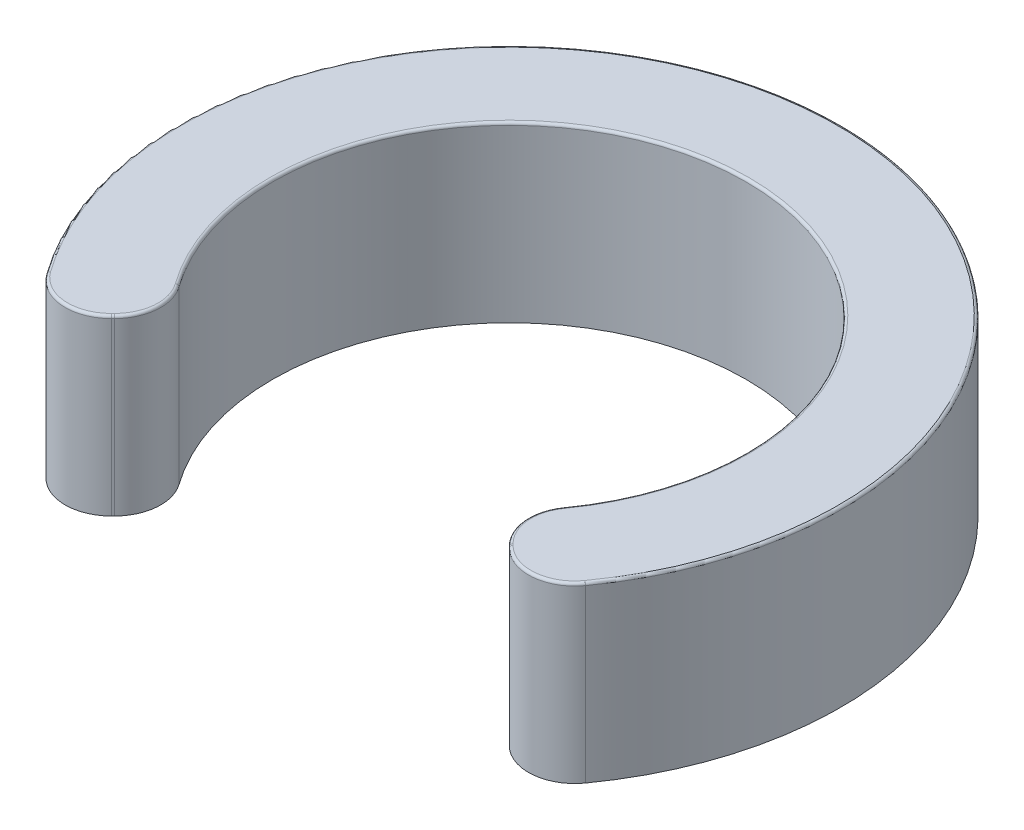
ISO-10303-21;
HEADER;
FILE_DESCRIPTION(('STEP AP214'),'2;1');
FILE_NAME('part.step','',(''),(''),'','','');
FILE_SCHEMA(('AUTOMOTIVE_DESIGN { 1 0 10303 214 1 1 1 1 }'));
ENDSEC;
DATA;
#1=APPLICATION_CONTEXT('core data for automotive mechanical design processes');
#2=APPLICATION_PROTOCOL_DEFINITION('international standard','automotive_design',2000,#1);
#3=PRODUCT_CONTEXT('',#1,'mechanical');
#4=PRODUCT('Part','Part','',(#3));
#5=PRODUCT_RELATED_PRODUCT_CATEGORY('part','',(#4));
#6=PRODUCT_DEFINITION_FORMATION('','',#4);
#7=PRODUCT_DEFINITION_CONTEXT('part definition',#1,'design');
#8=PRODUCT_DEFINITION('design','',#6,#7);
#9=PRODUCT_DEFINITION_SHAPE('','',#8);
#10=(LENGTH_UNIT() NAMED_UNIT(*) SI_UNIT(.MILLI.,.METRE.));
#11=(NAMED_UNIT(*) PLANE_ANGLE_UNIT() SI_UNIT($,.RADIAN.));
#12=(NAMED_UNIT(*) SI_UNIT($,.STERADIAN.) SOLID_ANGLE_UNIT());
#13=UNCERTAINTY_MEASURE_WITH_UNIT(LENGTH_MEASURE(1.E-05),#10,'distance_accuracy_value','');
#14=(GEOMETRIC_REPRESENTATION_CONTEXT(3) GLOBAL_UNCERTAINTY_ASSIGNED_CONTEXT((#13)) GLOBAL_UNIT_ASSIGNED_CONTEXT((#10,
#11,#12)) REPRESENTATION_CONTEXT('',''));
#15=CARTESIAN_POINT('',(0.,0.,0.));
#16=DIRECTION('',(0.,0.,1.));
#17=DIRECTION('',(1.,0.,0.));
#18=AXIS2_PLACEMENT_3D('',#15,#16,#17);
#19=CARTESIAN_POINT('',(0.,1.625,0.));
#20=DIRECTION('',(0.,-1.,0.));
#21=DIRECTION('',(0.,0.,-1.));
#22=AXIS2_PLACEMENT_3D('',#19,#20,#21);
#23=TOROIDAL_SURFACE('',#22,2.275,0.025);
#24=CARTESIAN_POINT('',(0.,1.625,0.));
#25=DIRECTION('',(0.,1.,0.));
#26=DIRECTION('',(0.,0.,-1.));
#27=AXIS2_PLACEMENT_3D('',#24,#25,#26);
#28=CIRCLE('',#27,2.25);
#29=CARTESIAN_POINT('',(1.82979902024299,1.625,1.30932637089375));
#30=VERTEX_POINT('',#29);
#31=CARTESIAN_POINT('',(-1.82979902024296,1.625,1.30932637089378));
#32=VERTEX_POINT('',#31);
#33=EDGE_CURVE('E163',#30,#32,#28,.T.);
#34=ORIENTED_EDGE('',*,*,#33,.F.);
#35=CARTESIAN_POINT('',(1.85013012046791,1.625,1.32387444168146));
#36=DIRECTION('',(0.581922831508337,0.,-0.813244008996881));
#37=DIRECTION('',(-0.813244008996881,0.,-0.581922831508337));
#38=AXIS2_PLACEMENT_3D('',#35,#36,#37);
#39=CIRCLE('',#38,0.025);
#40=CARTESIAN_POINT('',(1.85013012046791,1.65,1.32387444168146));
#41=VERTEX_POINT('',#40);
#42=EDGE_CURVE('E137',#30,#41,#39,.T.);
#43=ORIENTED_EDGE('',*,*,#42,.T.);
#44=CARTESIAN_POINT('',(0.,1.65,0.));
#45=DIRECTION('',(0.,-1.,0.));
#46=DIRECTION('',(0.,0.,-1.));
#47=AXIS2_PLACEMENT_3D('',#44,#45,#46);
#48=CIRCLE('',#47,2.275);
#49=CARTESIAN_POINT('',(-1.85013012046789,1.65,1.32387444168149));
#50=VERTEX_POINT('',#49);
#51=EDGE_CURVE('E148',#50,#41,#48,.T.);
#52=ORIENTED_EDGE('',*,*,#51,.F.);
#53=CARTESIAN_POINT('',(-1.85013012046789,1.625,1.32387444168149));
#54=DIRECTION('',(0.581922831508347,0.,0.813244008996874));
#55=DIRECTION('',(0.813244008996874,0.,-0.581922831508347));
#56=AXIS2_PLACEMENT_3D('',#53,#54,#55);
#57=CIRCLE('',#56,0.025);
#58=EDGE_CURVE('E36',#32,#50,#57,.T.);
#59=ORIENTED_EDGE('',*,*,#58,.F.);
#60=EDGE_LOOP('',(#34,#43,#52,#59));
#61=FACE_BOUND('',#60,.T.);
#62=ADVANCED_FACE('F17',(#61),#23,.T.);
#63=CARTESIAN_POINT('',(0.,1.625,0.));
#64=DIRECTION('',(0.,-1.,0.));
#65=DIRECTION('',(0.,0.,-1.));
#66=AXIS2_PLACEMENT_3D('',#63,#64,#65);
#67=TOROIDAL_SURFACE('',#66,3.125,0.025);
#68=CARTESIAN_POINT('',(0.,1.65,0.));
#69=DIRECTION('',(0.,1.,0.));
#70=DIRECTION('',(0.,0.,-1.));
#71=AXIS2_PLACEMENT_3D('',#68,#69,#70);
#72=CIRCLE('',#71,3.125);
#73=CARTESIAN_POINT('',(2.53916067045771,1.65,1.82161688881081));
#74=VERTEX_POINT('',#73);
#75=CARTESIAN_POINT('',(-2.53916067045768,1.65,1.82161688881085));
#76=VERTEX_POINT('',#75);
#77=EDGE_CURVE('E109',#74,#76,#72,.T.);
#78=ORIENTED_EDGE('',*,*,#77,.F.);
#79=CARTESIAN_POINT('',(2.53916067045771,1.625,1.82161688881081));
#80=DIRECTION('',(0.582917404419459,0.,-0.812531414546466));
#81=DIRECTION('',(-0.812531414546466,0.,-0.582917404419459));
#82=AXIS2_PLACEMENT_3D('',#79,#80,#81);
#83=CIRCLE('',#82,0.025);
#84=CARTESIAN_POINT('',(2.55947395582137,1.625,1.83618982392129));
#85=VERTEX_POINT('',#84);
#86=EDGE_CURVE('E112',#74,#85,#83,.T.);
#87=ORIENTED_EDGE('',*,*,#86,.T.);
#88=CARTESIAN_POINT('',(0.,1.625,0.));
#89=DIRECTION('',(0.,-1.,0.));
#90=DIRECTION('',(0.,0.,-1.));
#91=AXIS2_PLACEMENT_3D('',#88,#89,#90);
#92=CIRCLE('',#91,3.15);
#93=CARTESIAN_POINT('',(-2.55947395582134,1.625,1.83618982392134));
#94=VERTEX_POINT('',#93);
#95=EDGE_CURVE('E11',#94,#85,#92,.T.);
#96=ORIENTED_EDGE('',*,*,#95,.F.);
#97=CARTESIAN_POINT('',(-2.53916067045768,1.625,1.82161688881085));
#98=DIRECTION('',(0.582917404419479,0.,0.812531414546452));
#99=DIRECTION('',(0.812531414546452,0.,-0.582917404419479));
#100=AXIS2_PLACEMENT_3D('',#97,#98,#99);
#101=CIRCLE('',#100,0.0249999999999999);
#102=EDGE_CURVE('E113',#76,#94,#101,.T.);
#103=ORIENTED_EDGE('',*,*,#102,.F.);
#104=EDGE_LOOP('',(#78,#87,#96,#103));
#105=FACE_BOUND('',#104,.T.);
#106=ADVANCED_FACE('F110',(#105),#67,.T.);
#107=CARTESIAN_POINT('',(0.,1.65,0.));
#108=DIRECTION('',(0.,-1.,0.));
#109=DIRECTION('',(0.,0.,-1.));
#110=AXIS2_PLACEMENT_3D('',#107,#108,#109);
#111=CYLINDRICAL_SURFACE('',#110,3.15);
#112=ORIENTED_EDGE('',*,*,#95,.T.);
#113=DIRECTION('',(0.,-1.,0.));
#114=VECTOR('',#113,1.);
#115=CARTESIAN_POINT('',(2.55947395582137,1.65,1.83618982392129));
#116=LINE('',#115,#114);
#117=CARTESIAN_POINT('',(2.55947395582137,0.,1.83618982392129));
#118=VERTEX_POINT('',#117);
#119=EDGE_CURVE('E181',#85,#118,#116,.T.);
#120=ORIENTED_EDGE('',*,*,#119,.T.);
#121=CARTESIAN_POINT('',(0.,0.,0.));
#122=DIRECTION('',(0.,-1.,0.));
#123=DIRECTION('',(0.,0.,-1.));
#124=AXIS2_PLACEMENT_3D('',#121,#122,#123);
#125=CIRCLE('',#124,3.15);
#126=CARTESIAN_POINT('',(-2.55947395582134,0.,1.83618982392134));
#127=VERTEX_POINT('',#126);
#128=EDGE_CURVE('E152',#127,#118,#125,.T.);
#129=ORIENTED_EDGE('',*,*,#128,.F.);
#130=DIRECTION('',(0.,-1.,0.));
#131=VECTOR('',#130,1.);
#132=CARTESIAN_POINT('',(-2.55947395582134,1.65,1.83618982392134));
#133=LINE('',#132,#131);
#134=EDGE_CURVE('E156',#94,#127,#133,.T.);
#135=ORIENTED_EDGE('',*,*,#134,.F.);
#136=EDGE_LOOP('',(#112,#120,#129,#135));
#137=FACE_BOUND('',#136,.T.);
#138=ADVANCED_FACE('F243',(#137),#111,.T.);
#139=CARTESIAN_POINT('',(0.,1.65,0.));
#140=DIRECTION('',(0.,-1.,0.));
#141=DIRECTION('',(0.,0.,-1.));
#142=AXIS2_PLACEMENT_3D('',#139,#140,#141);
#143=CYLINDRICAL_SURFACE('',#142,2.25);
#144=DIRECTION('',(0.,-1.,0.));
#145=VECTOR('',#144,1.);
#146=CARTESIAN_POINT('',(1.82979902024299,1.65,1.30932637089375));
#147=LINE('',#146,#145);
#148=CARTESIAN_POINT('',(1.82979902024299,0.,1.30932637089375));
#149=VERTEX_POINT('',#148);
#150=EDGE_CURVE('E164',#30,#149,#147,.T.);
#151=ORIENTED_EDGE('',*,*,#150,.F.);
#152=ORIENTED_EDGE('',*,*,#33,.T.);
#153=DIRECTION('',(0.,-1.,0.));
#154=VECTOR('',#153,1.);
#155=CARTESIAN_POINT('',(-1.82979902024296,1.65,1.30932637089378));
#156=LINE('',#155,#154);
#157=CARTESIAN_POINT('',(-1.82979902024296,0.,1.30932637089378));
#158=VERTEX_POINT('',#157);
#159=EDGE_CURVE('E168',#32,#158,#156,.T.);
#160=ORIENTED_EDGE('',*,*,#159,.T.);
#161=CARTESIAN_POINT('',(0.,0.,0.));
#162=DIRECTION('',(0.,-1.,0.));
#163=DIRECTION('',(0.,0.,-1.));
#164=AXIS2_PLACEMENT_3D('',#161,#162,#163);
#165=CIRCLE('',#164,2.25);
#166=EDGE_CURVE('E27',#158,#149,#165,.T.);
#167=ORIENTED_EDGE('',*,*,#166,.T.);
#168=EDGE_LOOP('',(#151,#152,#160,#167));
#169=FACE_BOUND('',#168,.T.);
#170=ADVANCED_FACE('F229',(#169),#143,.F.);
#171=CARTESIAN_POINT('',(2.18762638420161,1.65,1.56537241675742));
#172=DIRECTION('',(0.,-1.,0.));
#173=DIRECTION('',(0.,0.,-1.));
#174=AXIS2_PLACEMENT_3D('',#171,#172,#173);
#175=CYLINDRICAL_SURFACE('',#174,0.44);
#176=DIRECTION('',(0.,-1.,0.));
#177=VECTOR('',#176,1.);
#178=CARTESIAN_POINT('',(1.87649940047954,1.65,1.8764994004795));
#179=LINE('',#178,#177);
#180=CARTESIAN_POINT('',(1.87649940047954,1.625,1.8764994004795));
#181=VERTEX_POINT('',#180);
#182=CARTESIAN_POINT('',(1.87649940047954,0.,1.8764994004795));
#183=VERTEX_POINT('',#182);
#184=EDGE_CURVE('E171',#181,#183,#179,.T.);
#185=ORIENTED_EDGE('',*,*,#184,.F.);
#186=CARTESIAN_POINT('',(2.18762638420161,1.625,1.56537241675742));
#187=DIRECTION('',(0.,-1.,0.));
#188=DIRECTION('',(0.,0.,-1.));
#189=AXIS2_PLACEMENT_3D('',#186,#187,#188);
#190=CIRCLE('',#189,0.44);
#191=EDGE_CURVE('E166',#181,#30,#190,.T.);
#192=ORIENTED_EDGE('',*,*,#191,.T.);
#193=ORIENTED_EDGE('',*,*,#150,.T.);
#194=CARTESIAN_POINT('',(2.18762638420161,0.,1.56537241675742));
#195=DIRECTION('',(0.,-1.,0.));
#196=DIRECTION('',(0.,0.,-1.));
#197=AXIS2_PLACEMENT_3D('',#194,#195,#196);
#198=CIRCLE('',#197,0.44);
#199=EDGE_CURVE('E131',#183,#149,#198,.T.);
#200=ORIENTED_EDGE('',*,*,#199,.F.);
#201=EDGE_LOOP('',(#185,#192,#193,#200));
#202=FACE_BOUND('',#201,.T.);
#203=ADVANCED_FACE('F231',(#202),#175,.T.);
#204=CARTESIAN_POINT('',(1.87649940047954,1.65,1.8764994004795));
#205=DIRECTION('',(0.707106781186558,0.,-0.707106781186537));
#206=DIRECTION('',(-0.707106781186537,0.,-0.707106781186558));
#207=AXIS2_PLACEMENT_3D('',#204,#205,#206);
#208=PLANE('',#207);
#209=DIRECTION('',(0.,-1.,0.));
#210=VECTOR('',#209,1.);
#211=CARTESIAN_POINT('',(1.89083314969885,1.65,1.89083314969881));
#212=LINE('',#211,#210);
#213=CARTESIAN_POINT('',(1.89083314969885,1.625,1.89083314969881));
#214=VERTEX_POINT('',#213);
#215=CARTESIAN_POINT('',(1.89083314969885,0.,1.89083314969881));
#216=VERTEX_POINT('',#215);
#217=EDGE_CURVE('E179',#214,#216,#212,.T.);
#218=ORIENTED_EDGE('',*,*,#217,.F.);
#219=DIRECTION('',(-0.707106781186537,0.,-0.707106781186558));
#220=VECTOR('',#219,1.);
#221=CARTESIAN_POINT('',(1.87649940047954,1.625,1.8764994004795));
#222=LINE('',#221,#220);
#223=EDGE_CURVE('E167',#214,#181,#222,.T.);
#224=ORIENTED_EDGE('',*,*,#223,.T.);
#225=ORIENTED_EDGE('',*,*,#184,.T.);
#226=DIRECTION('',(0.707106781186537,0.,0.707106781186558));
#227=VECTOR('',#226,1.);
#228=CARTESIAN_POINT('',(1.87649940047954,0.,1.8764994004795));
#229=LINE('',#228,#227);
#230=EDGE_CURVE('E174',#183,#216,#229,.T.);
#231=ORIENTED_EDGE('',*,*,#230,.T.);
#232=EDGE_LOOP('',(#218,#224,#225,#231));
#233=FACE_BOUND('',#232,.T.);
#234=ADVANCED_FACE('F236',(#233),#208,.F.);
#235=CARTESIAN_POINT('',(2.20196013342093,1.65,1.57970616597673));
#236=DIRECTION('',(0.,-1.,0.));
#237=DIRECTION('',(0.,0.,-1.));
#238=AXIS2_PLACEMENT_3D('',#235,#236,#237);
#239=CYLINDRICAL_SURFACE('',#238,0.440000000000001);
#240=ORIENTED_EDGE('',*,*,#119,.F.);
#241=CARTESIAN_POINT('',(2.20196013342093,1.625,1.57970616597673));
#242=DIRECTION('',(0.,-1.,0.));
#243=DIRECTION('',(0.,0.,-1.));
#244=AXIS2_PLACEMENT_3D('',#241,#242,#243);
#245=CIRCLE('',#244,0.440000000000001);
#246=EDGE_CURVE('E127',#85,#214,#245,.T.);
#247=ORIENTED_EDGE('',*,*,#246,.T.);
#248=ORIENTED_EDGE('',*,*,#217,.T.);
#249=CARTESIAN_POINT('',(2.20196013342093,0.,1.57970616597673));
#250=DIRECTION('',(0.,-1.,0.));
#251=DIRECTION('',(0.,0.,-1.));
#252=AXIS2_PLACEMENT_3D('',#249,#250,#251);
#253=CIRCLE('',#252,0.440000000000001);
#254=EDGE_CURVE('E155',#118,#216,#253,.T.);
#255=ORIENTED_EDGE('',*,*,#254,.F.);
#256=EDGE_LOOP('',(#240,#247,#248,#255));
#257=FACE_BOUND('',#256,.T.);
#258=ADVANCED_FACE('F241',(#257),#239,.T.);
#259=CARTESIAN_POINT('',(-2.2019601334209,1.65,1.57970616597677));
#260=DIRECTION('',(0.,-1.,0.));
#261=DIRECTION('',(0.,0.,-1.));
#262=AXIS2_PLACEMENT_3D('',#259,#260,#261);
#263=CYLINDRICAL_SURFACE('',#262,0.44);
#264=DIRECTION('',(0.,-1.,0.));
#265=VECTOR('',#264,1.);
#266=CARTESIAN_POINT('',(-1.89083314969881,1.65,1.89083314969885));
#267=LINE('',#266,#265);
#268=CARTESIAN_POINT('',(-1.89083314969881,1.625,1.89083314969885));
#269=VERTEX_POINT('',#268);
#270=CARTESIAN_POINT('',(-1.89083314969881,0.,1.89083314969885));
#271=VERTEX_POINT('',#270);
#272=EDGE_CURVE('E191',#269,#271,#267,.T.);
#273=ORIENTED_EDGE('',*,*,#272,.F.);
#274=CARTESIAN_POINT('',(-2.2019601334209,1.625,1.57970616597677));
#275=DIRECTION('',(0.,-1.,0.));
#276=DIRECTION('',(0.,0.,-1.));
#277=AXIS2_PLACEMENT_3D('',#274,#275,#276);
#278=CIRCLE('',#277,0.44);
#279=EDGE_CURVE('E159',#269,#94,#278,.T.);
#280=ORIENTED_EDGE('',*,*,#279,.T.);
#281=ORIENTED_EDGE('',*,*,#134,.T.);
#282=CARTESIAN_POINT('',(-2.2019601334209,0.,1.57970616597677));
#283=DIRECTION('',(0.,-1.,0.));
#284=DIRECTION('',(0.,0.,-1.));
#285=AXIS2_PLACEMENT_3D('',#282,#283,#284);
#286=CIRCLE('',#285,0.44);
#287=EDGE_CURVE('E154',#271,#127,#286,.T.);
#288=ORIENTED_EDGE('',*,*,#287,.F.);
#289=EDGE_LOOP('',(#273,#280,#281,#288));
#290=FACE_BOUND('',#289,.T.);
#291=ADVANCED_FACE('F247',(#290),#263,.T.);
#292=CARTESIAN_POINT('',(-1.89083314969881,1.65,1.89083314969885));
#293=DIRECTION('',(-0.707106781186553,0.,-0.707106781186542));
#294=DIRECTION('',(-0.707106781186542,0.,0.707106781186553));
#295=AXIS2_PLACEMENT_3D('',#292,#293,#294);
#296=PLANE('',#295);
#297=DIRECTION('',(0.,-1.,0.));
#298=VECTOR('',#297,1.);
#299=CARTESIAN_POINT('',(-1.8764994004795,1.65,1.87649940047954));
#300=LINE('',#299,#298);
#301=CARTESIAN_POINT('',(-1.8764994004795,1.625,1.87649940047954));
#302=VERTEX_POINT('',#301);
#303=CARTESIAN_POINT('',(-1.8764994004795,0.,1.87649940047954));
#304=VERTEX_POINT('',#303);
#305=EDGE_CURVE('E200',#302,#304,#300,.T.);
#306=ORIENTED_EDGE('',*,*,#305,.F.);
#307=DIRECTION('',(-0.707106781186542,0.,0.707106781186553));
#308=VECTOR('',#307,1.);
#309=CARTESIAN_POINT('',(-1.89083314969881,1.625,1.89083314969885));
#310=LINE('',#309,#308);
#311=EDGE_CURVE('E160',#302,#269,#310,.T.);
#312=ORIENTED_EDGE('',*,*,#311,.T.);
#313=ORIENTED_EDGE('',*,*,#272,.T.);
#314=DIRECTION('',(0.707106781186542,0.,-0.707106781186553));
#315=VECTOR('',#314,1.);
#316=CARTESIAN_POINT('',(-1.89083314969881,0.,1.89083314969885));
#317=LINE('',#316,#315);
#318=EDGE_CURVE('E194',#271,#304,#317,.T.);
#319=ORIENTED_EDGE('',*,*,#318,.T.);
#320=EDGE_LOOP('',(#306,#312,#313,#319));
#321=FACE_BOUND('',#320,.T.);
#322=ADVANCED_FACE('F259',(#321),#296,.F.);
#323=CARTESIAN_POINT('',(-2.18762638420159,1.65,1.56537241675746));
#324=DIRECTION('',(0.,-1.,0.));
#325=DIRECTION('',(0.,0.,-1.));
#326=AXIS2_PLACEMENT_3D('',#323,#324,#325);
#327=CYLINDRICAL_SURFACE('',#326,0.44);
#328=ORIENTED_EDGE('',*,*,#159,.F.);
#329=CARTESIAN_POINT('',(-2.18762638420159,1.625,1.56537241675746));
#330=DIRECTION('',(0.,-1.,0.));
#331=DIRECTION('',(0.,0.,-1.));
#332=AXIS2_PLACEMENT_3D('',#329,#330,#331);
#333=CIRCLE('',#332,0.44);
#334=EDGE_CURVE('E202',#32,#302,#333,.T.);
#335=ORIENTED_EDGE('',*,*,#334,.T.);
#336=ORIENTED_EDGE('',*,*,#305,.T.);
#337=CARTESIAN_POINT('',(-2.18762638420159,0.,1.56537241675746));
#338=DIRECTION('',(0.,-1.,0.));
#339=DIRECTION('',(0.,0.,-1.));
#340=AXIS2_PLACEMENT_3D('',#337,#338,#339);
#341=CIRCLE('',#340,0.44);
#342=EDGE_CURVE('E199',#158,#304,#341,.T.);
#343=ORIENTED_EDGE('',*,*,#342,.F.);
#344=EDGE_LOOP('',(#328,#335,#336,#343));
#345=FACE_BOUND('',#344,.T.);
#346=ADVANCED_FACE('F253',(#345),#327,.T.);
#347=CARTESIAN_POINT('',(0.,1.65,0.));
#348=DIRECTION('',(0.,-1.,0.));
#349=DIRECTION('',(0.,0.,-1.));
#350=AXIS2_PLACEMENT_3D('',#347,#348,#349);
#351=PLANE('',#350);
#352=DIRECTION('',(0.707106781186542,0.,-0.707106781186553));
#353=VECTOR('',#352,1.);
#354=CARTESIAN_POINT('',(-0.017677669529662,1.65,-0.0176776695296618));
#355=LINE('',#354,#353);
#356=CARTESIAN_POINT('',(-1.90851081922848,1.65,1.87315548016918));
#357=VERTEX_POINT('',#356);
#358=CARTESIAN_POINT('',(-1.89417707000917,1.65,1.85882173094987));
#359=VERTEX_POINT('',#358);
#360=EDGE_CURVE('E203',#357,#359,#355,.T.);
#361=ORIENTED_EDGE('',*,*,#360,.T.);
#362=CARTESIAN_POINT('',(-2.18762638420159,1.65,1.56537241675746));
#363=DIRECTION('',(0.,1.,0.));
#364=DIRECTION('',(0.,0.,-1.));
#365=AXIS2_PLACEMENT_3D('',#362,#363,#364);
#366=CIRCLE('',#365,0.415);
#367=EDGE_CURVE('E213',#359,#50,#366,.T.);
#368=ORIENTED_EDGE('',*,*,#367,.T.);
#369=ORIENTED_EDGE('',*,*,#51,.T.);
#370=CARTESIAN_POINT('',(2.18762638420161,1.65,1.56537241675742));
#371=DIRECTION('',(0.,1.,0.));
#372=DIRECTION('',(0.,0.,-1.));
#373=AXIS2_PLACEMENT_3D('',#370,#371,#372);
#374=CIRCLE('',#373,0.415);
#375=CARTESIAN_POINT('',(1.8941770700092,1.65,1.85882173094984));
#376=VERTEX_POINT('',#375);
#377=EDGE_CURVE('E216',#41,#376,#374,.T.);
#378=ORIENTED_EDGE('',*,*,#377,.T.);
#379=DIRECTION('',(0.707106781186537,0.,0.707106781186558));
#380=VECTOR('',#379,1.);
#381=CARTESIAN_POINT('',(0.0176776695297083,1.65,-0.0176776695297078));
#382=LINE('',#381,#380);
#383=CARTESIAN_POINT('',(1.90851081922851,1.65,1.87315548016915));
#384=VERTEX_POINT('',#383);
#385=EDGE_CURVE('E121',#376,#384,#382,.T.);
#386=ORIENTED_EDGE('',*,*,#385,.T.);
#387=CARTESIAN_POINT('',(2.20196013342093,1.65,1.57970616597673));
#388=DIRECTION('',(0.,1.,0.));
#389=DIRECTION('',(0.,0.,-1.));
#390=AXIS2_PLACEMENT_3D('',#387,#388,#389);
#391=CIRCLE('',#390,0.415000000000001);
#392=EDGE_CURVE('E103',#384,#74,#391,.T.);
#393=ORIENTED_EDGE('',*,*,#392,.T.);
#394=ORIENTED_EDGE('',*,*,#77,.T.);
#395=CARTESIAN_POINT('',(-2.2019601334209,1.65,1.57970616597677));
#396=DIRECTION('',(0.,1.,0.));
#397=DIRECTION('',(0.,0.,-1.));
#398=AXIS2_PLACEMENT_3D('',#395,#396,#397);
#399=CIRCLE('',#398,0.415);
#400=EDGE_CURVE('E116',#76,#357,#399,.T.);
#401=ORIENTED_EDGE('',*,*,#400,.T.);
#402=EDGE_LOOP('',(#361,#368,#369,#378,#386,#393,#394,#401));
#403=FACE_BOUND('',#402,.T.);
#404=ADVANCED_FACE('F119',(#403),#351,.F.);
#405=CARTESIAN_POINT('',(0.,0.,0.));
#406=DIRECTION('',(0.,-1.,0.));
#407=DIRECTION('',(0.,0.,-1.));
#408=AXIS2_PLACEMENT_3D('',#405,#406,#407);
#409=PLANE('',#408);
#410=ORIENTED_EDGE('',*,*,#166,.F.);
#411=ORIENTED_EDGE('',*,*,#342,.T.);
#412=ORIENTED_EDGE('',*,*,#318,.F.);
#413=ORIENTED_EDGE('',*,*,#287,.T.);
#414=ORIENTED_EDGE('',*,*,#128,.T.);
#415=ORIENTED_EDGE('',*,*,#254,.T.);
#416=ORIENTED_EDGE('',*,*,#230,.F.);
#417=ORIENTED_EDGE('',*,*,#199,.T.);
#418=EDGE_LOOP('',(#410,#411,#412,#413,#414,#415,#416,#417));
#419=FACE_BOUND('',#418,.T.);
#420=ADVANCED_FACE('F257',(#419),#409,.T.);
#421=CARTESIAN_POINT('',(2.20196013342093,1.625,1.57970616597673));
#422=DIRECTION('',(0.,-1.,0.));
#423=DIRECTION('',(0.,0.,-1.));
#424=AXIS2_PLACEMENT_3D('',#421,#422,#423);
#425=TOROIDAL_SURFACE('',#424,0.415000000000001,0.025);
#426=ORIENTED_EDGE('',*,*,#86,.F.);
#427=ORIENTED_EDGE('',*,*,#392,.F.);
#428=CARTESIAN_POINT('',(1.90851081922851,1.625,1.87315548016915));
#429=DIRECTION('',(-0.707106781186556,0.,-0.707106781186539));
#430=DIRECTION('',(-0.707106781186539,0.,0.707106781186556));
#431=AXIS2_PLACEMENT_3D('',#428,#429,#430);
#432=CIRCLE('',#431,0.025);
#433=EDGE_CURVE('E128',#214,#384,#432,.T.);
#434=ORIENTED_EDGE('',*,*,#433,.F.);
#435=ORIENTED_EDGE('',*,*,#246,.F.);
#436=EDGE_LOOP('',(#426,#427,#434,#435));
#437=FACE_BOUND('',#436,.T.);
#438=ADVANCED_FACE('F125',(#437),#425,.T.);
#439=CARTESIAN_POINT('',(0.0176776695297083,1.625,-0.0176776695297078));
#440=DIRECTION('',(0.707106781186537,0.,0.707106781186558));
#441=DIRECTION('',(0.707106781186558,0.,-0.707106781186537));
#442=AXIS2_PLACEMENT_3D('',#439,#440,#441);
#443=CYLINDRICAL_SURFACE('',#442,0.025);
#444=ORIENTED_EDGE('',*,*,#433,.T.);
#445=ORIENTED_EDGE('',*,*,#385,.F.);
#446=CARTESIAN_POINT('',(1.8941770700092,1.625,1.85882173094984));
#447=DIRECTION('',(-0.707106781186539,0.,-0.707106781186556));
#448=DIRECTION('',(-0.707106781186556,0.,0.707106781186539));
#449=AXIS2_PLACEMENT_3D('',#446,#447,#448);
#450=CIRCLE('',#449,0.025);
#451=EDGE_CURVE('E129',#181,#376,#450,.T.);
#452=ORIENTED_EDGE('',*,*,#451,.F.);
#453=ORIENTED_EDGE('',*,*,#223,.F.);
#454=EDGE_LOOP('',(#444,#445,#452,#453));
#455=FACE_BOUND('',#454,.T.);
#456=ADVANCED_FACE('F234',(#455),#443,.T.);
#457=CARTESIAN_POINT('',(2.18762638420161,1.625,1.56537241675742));
#458=DIRECTION('',(0.,-1.,0.));
#459=DIRECTION('',(0.,0.,-1.));
#460=AXIS2_PLACEMENT_3D('',#457,#458,#459);
#461=TOROIDAL_SURFACE('',#460,0.415,0.025);
#462=ORIENTED_EDGE('',*,*,#451,.T.);
#463=ORIENTED_EDGE('',*,*,#377,.F.);
#464=ORIENTED_EDGE('',*,*,#42,.F.);
#465=ORIENTED_EDGE('',*,*,#191,.F.);
#466=EDGE_LOOP('',(#462,#463,#464,#465));
#467=FACE_BOUND('',#466,.T.);
#468=ADVANCED_FACE('F222',(#467),#461,.T.);
#469=CARTESIAN_POINT('',(-2.2019601334209,1.625,1.57970616597677));
#470=DIRECTION('',(0.,-1.,0.));
#471=DIRECTION('',(0.,0.,-1.));
#472=AXIS2_PLACEMENT_3D('',#469,#470,#471);
#473=TOROIDAL_SURFACE('',#472,0.415,0.025);
#474=ORIENTED_EDGE('',*,*,#102,.T.);
#475=ORIENTED_EDGE('',*,*,#279,.F.);
#476=CARTESIAN_POINT('',(-1.90851081922848,1.625,1.87315548016918));
#477=DIRECTION('',(0.707106781186539,0.,-0.707106781186556));
#478=DIRECTION('',(-0.707106781186556,0.,-0.707106781186539));
#479=AXIS2_PLACEMENT_3D('',#476,#477,#478);
#480=CIRCLE('',#479,0.025);
#481=EDGE_CURVE('E139',#357,#269,#480,.T.);
#482=ORIENTED_EDGE('',*,*,#481,.F.);
#483=ORIENTED_EDGE('',*,*,#400,.F.);
#484=EDGE_LOOP('',(#474,#475,#482,#483));
#485=FACE_BOUND('',#484,.T.);
#486=ADVANCED_FACE('F249',(#485),#473,.T.);
#487=CARTESIAN_POINT('',(-0.017677669529662,1.625,-0.0176776695296618));
#488=DIRECTION('',(0.707106781186542,0.,-0.707106781186553));
#489=DIRECTION('',(-0.707106781186553,0.,-0.707106781186542));
#490=AXIS2_PLACEMENT_3D('',#487,#488,#489);
#491=CYLINDRICAL_SURFACE('',#490,0.025);
#492=ORIENTED_EDGE('',*,*,#481,.T.);
#493=ORIENTED_EDGE('',*,*,#311,.F.);
#494=CARTESIAN_POINT('',(-1.89417707000917,1.625,1.85882173094987));
#495=DIRECTION('',(0.707106781186539,0.,-0.707106781186556));
#496=DIRECTION('',(-0.707106781186556,0.,-0.707106781186539));
#497=AXIS2_PLACEMENT_3D('',#494,#495,#496);
#498=CIRCLE('',#497,0.025);
#499=EDGE_CURVE('E21',#359,#302,#498,.T.);
#500=ORIENTED_EDGE('',*,*,#499,.F.);
#501=ORIENTED_EDGE('',*,*,#360,.F.);
#502=EDGE_LOOP('',(#492,#493,#500,#501));
#503=FACE_BOUND('',#502,.T.);
#504=ADVANCED_FACE('F251',(#503),#491,.T.);
#505=CARTESIAN_POINT('',(-2.18762638420159,1.625,1.56537241675746));
#506=DIRECTION('',(0.,-1.,0.));
#507=DIRECTION('',(0.,0.,-1.));
#508=AXIS2_PLACEMENT_3D('',#505,#506,#507);
#509=TOROIDAL_SURFACE('',#508,0.415,0.025);
#510=ORIENTED_EDGE('',*,*,#58,.T.);
#511=ORIENTED_EDGE('',*,*,#367,.F.);
#512=ORIENTED_EDGE('',*,*,#499,.T.);
#513=ORIENTED_EDGE('',*,*,#334,.F.);
#514=EDGE_LOOP('',(#510,#511,#512,#513));
#515=FACE_BOUND('',#514,.T.);
#516=ADVANCED_FACE('F19',(#515),#509,.T.);
#517=CLOSED_SHELL('',(#62,#106,#138,#170,#203,#234,#258,#291,#322,#346,#404,#420,#438,#456,#468,
#486,#504,#516));
#518=MANIFOLD_SOLID_BREP('B1',#517);
#519=ADVANCED_BREP_SHAPE_REPRESENTATION('',(#18,#518),#14);
#520=SHAPE_DEFINITION_REPRESENTATION(#9,#519);
ENDSEC;
END-ISO-10303-21;
